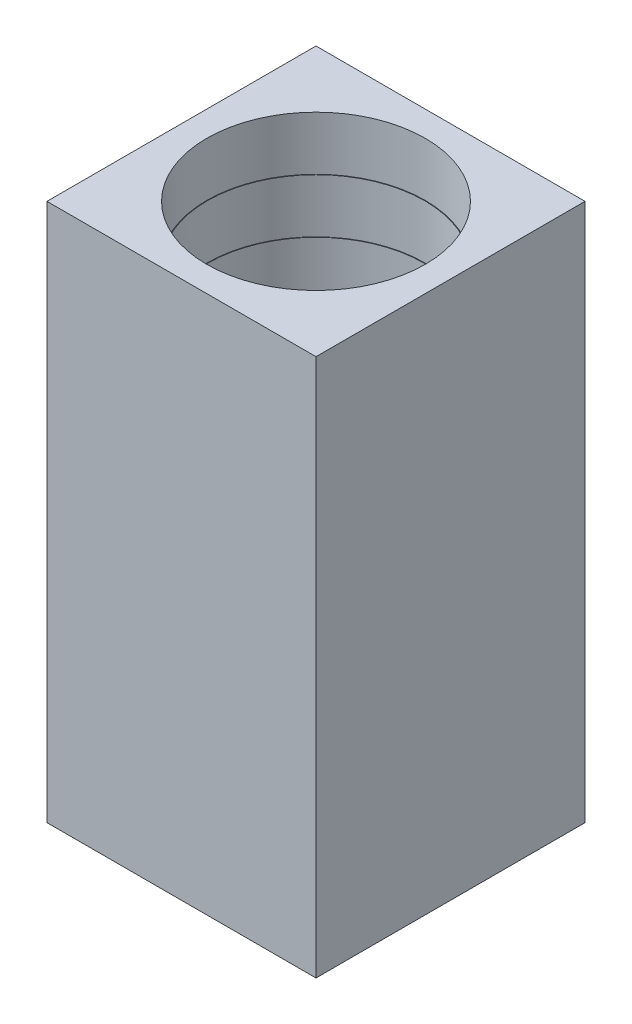
ISO-10303-21;
HEADER;
FILE_DESCRIPTION(('STEP AP214'),'2;1');
FILE_NAME('part.step','',(''),(''),'','','');
FILE_SCHEMA(('AUTOMOTIVE_DESIGN { 1 0 10303 214 1 1 1 1 }'));
ENDSEC;
DATA;
#1=APPLICATION_CONTEXT('core data for automotive mechanical design processes');
#2=APPLICATION_PROTOCOL_DEFINITION('international standard','automotive_design',2000,#1);
#3=PRODUCT_CONTEXT('',#1,'mechanical');
#4=PRODUCT('Part','Part','',(#3));
#5=PRODUCT_RELATED_PRODUCT_CATEGORY('part','',(#4));
#6=PRODUCT_DEFINITION_FORMATION('','',#4);
#7=PRODUCT_DEFINITION_CONTEXT('part definition',#1,'design');
#8=PRODUCT_DEFINITION('design','',#6,#7);
#9=PRODUCT_DEFINITION_SHAPE('','',#8);
#10=(LENGTH_UNIT() NAMED_UNIT(*) SI_UNIT(.MILLI.,.METRE.));
#11=(NAMED_UNIT(*) PLANE_ANGLE_UNIT() SI_UNIT($,.RADIAN.));
#12=(NAMED_UNIT(*) SI_UNIT($,.STERADIAN.) SOLID_ANGLE_UNIT());
#13=UNCERTAINTY_MEASURE_WITH_UNIT(LENGTH_MEASURE(1.E-05),#10,'distance_accuracy_value','');
#14=(GEOMETRIC_REPRESENTATION_CONTEXT(3) GLOBAL_UNCERTAINTY_ASSIGNED_CONTEXT((#13)) GLOBAL_UNIT_ASSIGNED_CONTEXT((#10,
#11,#12)) REPRESENTATION_CONTEXT('',''));
#15=CARTESIAN_POINT('',(0.,0.,0.));
#16=DIRECTION('',(0.,0.,1.));
#17=DIRECTION('',(1.,0.,0.));
#18=AXIS2_PLACEMENT_3D('',#15,#16,#17);
#19=CARTESIAN_POINT('',(0.,80.,0.));
#20=DIRECTION('',(0.,1.,0.));
#21=DIRECTION('',(0.,0.,1.));
#22=AXIS2_PLACEMENT_3D('',#19,#20,#21);
#23=CYLINDRICAL_SURFACE('',#22,20.2);
#24=CARTESIAN_POINT('',(0.,80.,0.));
#25=DIRECTION('',(0.,1.,0.));
#26=DIRECTION('',(0.,0.,1.));
#27=AXIS2_PLACEMENT_3D('',#24,#25,#26);
#28=CIRCLE('',#27,20.2);
#29=CARTESIAN_POINT('',(0.,80.,20.2));
#30=VERTEX_POINT('',#29);
#31=EDGE_CURVE('E154',#30,#30,#28,.T.);
#32=ORIENTED_EDGE('',*,*,#31,.F.);
#33=EDGE_LOOP('',(#32));
#34=FACE_BOUND('',#33,.T.);
#35=CARTESIAN_POINT('',(0.,90.,0.));
#36=DIRECTION('',(0.,1.,0.));
#37=DIRECTION('',(0.,0.,1.));
#38=AXIS2_PLACEMENT_3D('',#35,#36,#37);
#39=CIRCLE('',#38,20.2);
#40=CARTESIAN_POINT('',(0.,90.,20.2));
#41=VERTEX_POINT('',#40);
#42=EDGE_CURVE('E167',#41,#41,#39,.T.);
#43=ORIENTED_EDGE('',*,*,#42,.T.);
#44=EDGE_LOOP('',(#43));
#45=FACE_BOUND('',#44,.T.);
#46=ADVANCED_FACE('F45',(#34,#45),#23,.F.);
#47=CARTESIAN_POINT('',(0.,70.,0.));
#48=DIRECTION('',(0.,1.,0.));
#49=DIRECTION('',(0.,0.,1.));
#50=AXIS2_PLACEMENT_3D('',#47,#48,#49);
#51=CYLINDRICAL_SURFACE('',#50,20.1);
#52=CARTESIAN_POINT('',(0.,70.,0.));
#53=DIRECTION('',(0.,1.,0.));
#54=DIRECTION('',(0.,0.,1.));
#55=AXIS2_PLACEMENT_3D('',#52,#53,#54);
#56=CIRCLE('',#55,20.1);
#57=CARTESIAN_POINT('',(0.,70.,20.1));
#58=VERTEX_POINT('',#57);
#59=EDGE_CURVE('E146',#58,#58,#56,.T.);
#60=ORIENTED_EDGE('',*,*,#59,.F.);
#61=EDGE_LOOP('',(#60));
#62=FACE_BOUND('',#61,.T.);
#63=CARTESIAN_POINT('',(0.,80.,0.));
#64=DIRECTION('',(0.,1.,0.));
#65=DIRECTION('',(0.,0.,1.));
#66=AXIS2_PLACEMENT_3D('',#63,#64,#65);
#67=CIRCLE('',#66,20.1);
#68=CARTESIAN_POINT('',(0.,80.,20.1));
#69=VERTEX_POINT('',#68);
#70=EDGE_CURVE('E158',#69,#69,#67,.T.);
#71=ORIENTED_EDGE('',*,*,#70,.T.);
#72=EDGE_LOOP('',(#71));
#73=FACE_BOUND('',#72,.T.);
#74=ADVANCED_FACE('F197',(#62,#73),#51,.F.);
#75=CARTESIAN_POINT('',(0.,60.,0.));
#76=DIRECTION('',(0.,1.,0.));
#77=DIRECTION('',(0.,0.,1.));
#78=AXIS2_PLACEMENT_3D('',#75,#76,#77);
#79=CYLINDRICAL_SURFACE('',#78,20.);
#80=CARTESIAN_POINT('',(0.,60.,0.));
#81=DIRECTION('',(0.,1.,0.));
#82=DIRECTION('',(0.,0.,1.));
#83=AXIS2_PLACEMENT_3D('',#80,#81,#82);
#84=CIRCLE('',#83,20.);
#85=CARTESIAN_POINT('',(0.,60.,20.));
#86=VERTEX_POINT('',#85);
#87=EDGE_CURVE('E138',#86,#86,#84,.T.);
#88=ORIENTED_EDGE('',*,*,#87,.F.);
#89=EDGE_LOOP('',(#88));
#90=FACE_BOUND('',#89,.T.);
#91=CARTESIAN_POINT('',(0.,70.,0.));
#92=DIRECTION('',(0.,1.,0.));
#93=DIRECTION('',(0.,0.,1.));
#94=AXIS2_PLACEMENT_3D('',#91,#92,#93);
#95=CIRCLE('',#94,20.);
#96=CARTESIAN_POINT('',(0.,70.,20.));
#97=VERTEX_POINT('',#96);
#98=EDGE_CURVE('E150',#97,#97,#95,.T.);
#99=ORIENTED_EDGE('',*,*,#98,.T.);
#100=EDGE_LOOP('',(#99));
#101=FACE_BOUND('',#100,.T.);
#102=ADVANCED_FACE('F204',(#90,#101),#79,.F.);
#103=CARTESIAN_POINT('',(0.,60.,0.));
#104=DIRECTION('',(0.,1.,0.));
#105=DIRECTION('',(0.,0.,1.));
#106=AXIS2_PLACEMENT_3D('',#103,#104,#105);
#107=PLANE('',#106);
#108=CARTESIAN_POINT('',(0.,60.,0.));
#109=DIRECTION('',(0.,1.,0.));
#110=DIRECTION('',(0.,0.,1.));
#111=AXIS2_PLACEMENT_3D('',#108,#109,#110);
#112=CIRCLE('',#111,19.9);
#113=CARTESIAN_POINT('',(0.,60.,19.9));
#114=VERTEX_POINT('',#113);
#115=EDGE_CURVE('E142',#114,#114,#112,.T.);
#116=ORIENTED_EDGE('',*,*,#115,.F.);
#117=EDGE_LOOP('',(#116));
#118=FACE_BOUND('',#117,.T.);
#119=ORIENTED_EDGE('',*,*,#87,.T.);
#120=EDGE_LOOP('',(#119));
#121=FACE_BOUND('',#120,.T.);
#122=ADVANCED_FACE('F215',(#118,#121),#107,.T.);
#123=CARTESIAN_POINT('',(0.,50.,0.));
#124=DIRECTION('',(0.,1.,0.));
#125=DIRECTION('',(0.,0.,1.));
#126=AXIS2_PLACEMENT_3D('',#123,#124,#125);
#127=PLANE('',#126);
#128=CARTESIAN_POINT('',(0.,50.,0.));
#129=DIRECTION('',(0.,1.,0.));
#130=DIRECTION('',(0.,0.,1.));
#131=AXIS2_PLACEMENT_3D('',#128,#129,#130);
#132=CIRCLE('',#131,19.9);
#133=CARTESIAN_POINT('',(0.,50.,19.9));
#134=VERTEX_POINT('',#133);
#135=EDGE_CURVE('E118',#134,#134,#132,.T.);
#136=ORIENTED_EDGE('',*,*,#135,.T.);
#137=EDGE_LOOP('',(#136));
#138=FACE_BOUND('',#137,.T.);
#139=ADVANCED_FACE('F218',(#138),#127,.T.);
#140=CARTESIAN_POINT('',(0.,50.,0.));
#141=DIRECTION('',(0.,1.,0.));
#142=DIRECTION('',(0.,0.,1.));
#143=AXIS2_PLACEMENT_3D('',#140,#141,#142);
#144=CYLINDRICAL_SURFACE('',#143,19.9);
#145=ORIENTED_EDGE('',*,*,#135,.F.);
#146=EDGE_LOOP('',(#145));
#147=FACE_BOUND('',#146,.T.);
#148=ORIENTED_EDGE('',*,*,#115,.T.);
#149=EDGE_LOOP('',(#148));
#150=FACE_BOUND('',#149,.T.);
#151=ADVANCED_FACE('F212',(#147,#150),#144,.F.);
#152=CARTESIAN_POINT('',(0.,70.,0.));
#153=DIRECTION('',(0.,1.,0.));
#154=DIRECTION('',(0.,0.,1.));
#155=AXIS2_PLACEMENT_3D('',#152,#153,#154);
#156=PLANE('',#155);
#157=ORIENTED_EDGE('',*,*,#98,.F.);
#158=EDGE_LOOP('',(#157));
#159=FACE_BOUND('',#158,.T.);
#160=ORIENTED_EDGE('',*,*,#59,.T.);
#161=EDGE_LOOP('',(#160));
#162=FACE_BOUND('',#161,.T.);
#163=ADVANCED_FACE('F210',(#159,#162),#156,.T.);
#164=CARTESIAN_POINT('',(0.,80.,0.));
#165=DIRECTION('',(0.,1.,0.));
#166=DIRECTION('',(0.,0.,1.));
#167=AXIS2_PLACEMENT_3D('',#164,#165,#166);
#168=PLANE('',#167);
#169=ORIENTED_EDGE('',*,*,#70,.F.);
#170=EDGE_LOOP('',(#169));
#171=FACE_BOUND('',#170,.T.);
#172=ORIENTED_EDGE('',*,*,#31,.T.);
#173=EDGE_LOOP('',(#172));
#174=FACE_BOUND('',#173,.T.);
#175=ADVANCED_FACE('F185',(#171,#174),#168,.T.);
#176=CARTESIAN_POINT('',(0.,90.,0.));
#177=DIRECTION('',(0.,1.,0.));
#178=DIRECTION('',(0.,0.,1.));
#179=AXIS2_PLACEMENT_3D('',#176,#177,#178);
#180=CYLINDRICAL_SURFACE('',#179,20.3);
#181=CARTESIAN_POINT('',(0.,90.,0.));
#182=DIRECTION('',(0.,1.,0.));
#183=DIRECTION('',(0.,0.,1.));
#184=AXIS2_PLACEMENT_3D('',#181,#182,#183);
#185=CIRCLE('',#184,20.3);
#186=CARTESIAN_POINT('',(0.,90.,20.3));
#187=VERTEX_POINT('',#186);
#188=EDGE_CURVE('E162',#187,#187,#185,.T.);
#189=ORIENTED_EDGE('',*,*,#188,.F.);
#190=EDGE_LOOP('',(#189));
#191=FACE_BOUND('',#190,.T.);
#192=CARTESIAN_POINT('',(0.,100.,0.));
#193=DIRECTION('',(0.,1.,0.));
#194=DIRECTION('',(0.,0.,1.));
#195=AXIS2_PLACEMENT_3D('',#192,#193,#194);
#196=CIRCLE('',#195,20.3);
#197=CARTESIAN_POINT('',(0.,100.,20.3));
#198=VERTEX_POINT('',#197);
#199=EDGE_CURVE('E163',#198,#198,#196,.T.);
#200=ORIENTED_EDGE('',*,*,#199,.T.);
#201=EDGE_LOOP('',(#200));
#202=FACE_BOUND('',#201,.T.);
#203=ADVANCED_FACE('F179',(#191,#202),#180,.F.);
#204=CARTESIAN_POINT('',(0.,90.,0.));
#205=DIRECTION('',(0.,1.,0.));
#206=DIRECTION('',(0.,0.,1.));
#207=AXIS2_PLACEMENT_3D('',#204,#205,#206);
#208=PLANE('',#207);
#209=ORIENTED_EDGE('',*,*,#42,.F.);
#210=EDGE_LOOP('',(#209));
#211=FACE_BOUND('',#210,.T.);
#212=ORIENTED_EDGE('',*,*,#188,.T.);
#213=EDGE_LOOP('',(#212));
#214=FACE_BOUND('',#213,.T.);
#215=ADVANCED_FACE('F176',(#211,#214),#208,.T.);
#216=CARTESIAN_POINT('',(0.,0.,0.));
#217=DIRECTION('',(0.,1.,0.));
#218=DIRECTION('',(0.,0.,1.));
#219=AXIS2_PLACEMENT_3D('',#216,#217,#218);
#220=PLANE('',#219);
#221=DIRECTION('',(0.,0.,-1.));
#222=VECTOR('',#221,1.);
#223=CARTESIAN_POINT('',(25.,0.,-25.));
#224=LINE('',#223,#222);
#225=CARTESIAN_POINT('',(25.,0.,25.));
#226=VERTEX_POINT('',#225);
#227=CARTESIAN_POINT('',(25.,0.,-25.));
#228=VERTEX_POINT('',#227);
#229=EDGE_CURVE('E114',#226,#228,#224,.T.);
#230=ORIENTED_EDGE('',*,*,#229,.F.);
#231=DIRECTION('',(1.,0.,0.));
#232=VECTOR('',#231,1.);
#233=CARTESIAN_POINT('',(-25.,0.,25.));
#234=LINE('',#233,#232);
#235=CARTESIAN_POINT('',(-25.,0.,25.));
#236=VERTEX_POINT('',#235);
#237=EDGE_CURVE('E86',#236,#226,#234,.T.);
#238=ORIENTED_EDGE('',*,*,#237,.F.);
#239=DIRECTION('',(0.,0.,1.));
#240=VECTOR('',#239,1.);
#241=CARTESIAN_POINT('',(-25.,0.,-25.));
#242=LINE('',#241,#240);
#243=CARTESIAN_POINT('',(-25.,0.,-25.));
#244=VERTEX_POINT('',#243);
#245=EDGE_CURVE('E80',#244,#236,#242,.T.);
#246=ORIENTED_EDGE('',*,*,#245,.F.);
#247=DIRECTION('',(-1.,0.,0.));
#248=VECTOR('',#247,1.);
#249=CARTESIAN_POINT('',(-25.,0.,-25.));
#250=LINE('',#249,#248);
#251=EDGE_CURVE('E103',#228,#244,#250,.T.);
#252=ORIENTED_EDGE('',*,*,#251,.F.);
#253=EDGE_LOOP('',(#230,#238,#246,#252));
#254=FACE_BOUND('',#253,.T.);
#255=ADVANCED_FACE('F131',(#254),#220,.F.);
#256=CARTESIAN_POINT('',(-25.,100.,25.));
#257=DIRECTION('',(0.,0.,-1.));
#258=DIRECTION('',(-1.,0.,0.));
#259=AXIS2_PLACEMENT_3D('',#256,#257,#258);
#260=PLANE('',#259);
#261=ORIENTED_EDGE('',*,*,#237,.T.);
#262=DIRECTION('',(0.,-1.,0.));
#263=VECTOR('',#262,1.);
#264=CARTESIAN_POINT('',(25.,100.,25.));
#265=LINE('',#264,#263);
#266=CARTESIAN_POINT('',(25.,100.,25.));
#267=VERTEX_POINT('',#266);
#268=EDGE_CURVE('E110',#267,#226,#265,.T.);
#269=ORIENTED_EDGE('',*,*,#268,.F.);
#270=DIRECTION('',(1.,0.,0.));
#271=VECTOR('',#270,1.);
#272=CARTESIAN_POINT('',(-25.,100.,25.));
#273=LINE('',#272,#271);
#274=CARTESIAN_POINT('',(-25.,100.,25.));
#275=VERTEX_POINT('',#274);
#276=EDGE_CURVE('E63',#275,#267,#273,.T.);
#277=ORIENTED_EDGE('',*,*,#276,.F.);
#278=DIRECTION('',(0.,-1.,0.));
#279=VECTOR('',#278,1.);
#280=CARTESIAN_POINT('',(-25.,100.,25.));
#281=LINE('',#280,#279);
#282=EDGE_CURVE('E105',#275,#236,#281,.T.);
#283=ORIENTED_EDGE('',*,*,#282,.T.);
#284=EDGE_LOOP('',(#261,#269,#277,#283));
#285=FACE_BOUND('',#284,.T.);
#286=ADVANCED_FACE('F128',(#285),#260,.F.);
#287=CARTESIAN_POINT('',(-25.,100.,-25.));
#288=DIRECTION('',(1.,0.,0.));
#289=DIRECTION('',(0.,0.,-1.));
#290=AXIS2_PLACEMENT_3D('',#287,#288,#289);
#291=PLANE('',#290);
#292=ORIENTED_EDGE('',*,*,#245,.T.);
#293=ORIENTED_EDGE('',*,*,#282,.F.);
#294=DIRECTION('',(0.,0.,1.));
#295=VECTOR('',#294,1.);
#296=CARTESIAN_POINT('',(-25.,100.,-25.));
#297=LINE('',#296,#295);
#298=CARTESIAN_POINT('',(-25.,100.,-25.));
#299=VERTEX_POINT('',#298);
#300=EDGE_CURVE('E96',#299,#275,#297,.T.);
#301=ORIENTED_EDGE('',*,*,#300,.F.);
#302=DIRECTION('',(0.,-1.,0.));
#303=VECTOR('',#302,1.);
#304=CARTESIAN_POINT('',(-25.,100.,-25.));
#305=LINE('',#304,#303);
#306=EDGE_CURVE('E55',#299,#244,#305,.T.);
#307=ORIENTED_EDGE('',*,*,#306,.T.);
#308=EDGE_LOOP('',(#292,#293,#301,#307));
#309=FACE_BOUND('',#308,.T.);
#310=ADVANCED_FACE('F106',(#309),#291,.F.);
#311=CARTESIAN_POINT('',(-25.,100.,-25.));
#312=DIRECTION('',(0.,0.,1.));
#313=DIRECTION('',(1.,0.,0.));
#314=AXIS2_PLACEMENT_3D('',#311,#312,#313);
#315=PLANE('',#314);
#316=ORIENTED_EDGE('',*,*,#251,.T.);
#317=ORIENTED_EDGE('',*,*,#306,.F.);
#318=DIRECTION('',(-1.,0.,0.));
#319=VECTOR('',#318,1.);
#320=CARTESIAN_POINT('',(-25.,100.,-25.));
#321=LINE('',#320,#319);
#322=CARTESIAN_POINT('',(25.,100.,-25.));
#323=VERTEX_POINT('',#322);
#324=EDGE_CURVE('E93',#323,#299,#321,.T.);
#325=ORIENTED_EDGE('',*,*,#324,.F.);
#326=DIRECTION('',(0.,-1.,0.));
#327=VECTOR('',#326,1.);
#328=CARTESIAN_POINT('',(25.,100.,-25.));
#329=LINE('',#328,#327);
#330=EDGE_CURVE('E11',#323,#228,#329,.T.);
#331=ORIENTED_EDGE('',*,*,#330,.T.);
#332=EDGE_LOOP('',(#316,#317,#325,#331));
#333=FACE_BOUND('',#332,.T.);
#334=ADVANCED_FACE('F102',(#333),#315,.F.);
#335=CARTESIAN_POINT('',(25.,100.,-25.));
#336=DIRECTION('',(-1.,0.,0.));
#337=DIRECTION('',(0.,0.,1.));
#338=AXIS2_PLACEMENT_3D('',#335,#336,#337);
#339=PLANE('',#338);
#340=ORIENTED_EDGE('',*,*,#229,.T.);
#341=ORIENTED_EDGE('',*,*,#330,.F.);
#342=DIRECTION('',(0.,0.,-1.));
#343=VECTOR('',#342,1.);
#344=CARTESIAN_POINT('',(25.,100.,-25.));
#345=LINE('',#344,#343);
#346=EDGE_CURVE('E98',#267,#323,#345,.T.);
#347=ORIENTED_EDGE('',*,*,#346,.F.);
#348=ORIENTED_EDGE('',*,*,#268,.T.);
#349=EDGE_LOOP('',(#340,#341,#347,#348));
#350=FACE_BOUND('',#349,.T.);
#351=ADVANCED_FACE('F47',(#350),#339,.F.);
#352=CARTESIAN_POINT('',(0.,100.,0.));
#353=DIRECTION('',(0.,1.,0.));
#354=DIRECTION('',(0.,0.,1.));
#355=AXIS2_PLACEMENT_3D('',#352,#353,#354);
#356=PLANE('',#355);
#357=ORIENTED_EDGE('',*,*,#199,.F.);
#358=EDGE_LOOP('',(#357));
#359=FACE_BOUND('',#358,.T.);
#360=ORIENTED_EDGE('',*,*,#346,.T.);
#361=ORIENTED_EDGE('',*,*,#324,.T.);
#362=ORIENTED_EDGE('',*,*,#300,.T.);
#363=ORIENTED_EDGE('',*,*,#276,.T.);
#364=EDGE_LOOP('',(#360,#361,#362,#363));
#365=FACE_BOUND('',#364,.T.);
#366=ADVANCED_FACE('F94',(#359,#365),#356,.T.);
#367=CLOSED_SHELL('',(#46,#74,#102,#122,#139,#151,#163,#175,#203,#215,#255,#286,#310,#334,#351,#366));
#368=MANIFOLD_SOLID_BREP('B2',#367);
#369=ADVANCED_BREP_SHAPE_REPRESENTATION('',(#18,#368),#14);
#370=SHAPE_DEFINITION_REPRESENTATION(#9,#369);
ENDSEC;
END-ISO-10303-21;
